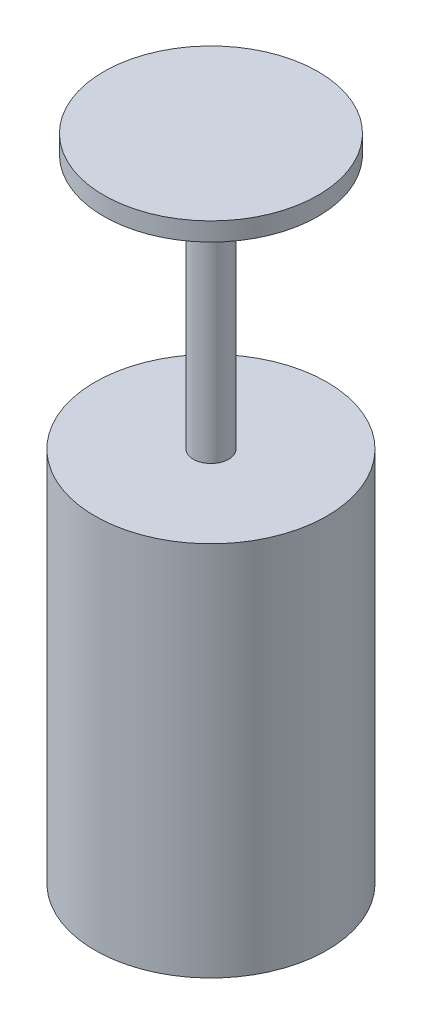
ISO-10303-21;
HEADER;
FILE_DESCRIPTION(('STEP AP214'),'2;1');
FILE_NAME('part.step','',(''),(''),'','','');
FILE_SCHEMA(('AUTOMOTIVE_DESIGN { 1 0 10303 214 1 1 1 1 }'));
ENDSEC;
DATA;
#1=APPLICATION_CONTEXT('core data for automotive mechanical design processes');
#2=APPLICATION_PROTOCOL_DEFINITION('international standard','automotive_design',2000,#1);
#3=PRODUCT_CONTEXT('',#1,'mechanical');
#4=PRODUCT('Part','Part','',(#3));
#5=PRODUCT_RELATED_PRODUCT_CATEGORY('part','',(#4));
#6=PRODUCT_DEFINITION_FORMATION('','',#4);
#7=PRODUCT_DEFINITION_CONTEXT('part definition',#1,'design');
#8=PRODUCT_DEFINITION('design','',#6,#7);
#9=PRODUCT_DEFINITION_SHAPE('','',#8);
#10=(LENGTH_UNIT() NAMED_UNIT(*) SI_UNIT(.MILLI.,.METRE.));
#11=(NAMED_UNIT(*) PLANE_ANGLE_UNIT() SI_UNIT($,.RADIAN.));
#12=(NAMED_UNIT(*) SI_UNIT($,.STERADIAN.) SOLID_ANGLE_UNIT());
#13=UNCERTAINTY_MEASURE_WITH_UNIT(LENGTH_MEASURE(1.E-05),#10,'distance_accuracy_value','');
#14=(GEOMETRIC_REPRESENTATION_CONTEXT(3) GLOBAL_UNCERTAINTY_ASSIGNED_CONTEXT((#13)) GLOBAL_UNIT_ASSIGNED_CONTEXT((#10,
#11,#12)) REPRESENTATION_CONTEXT('',''));
#15=CARTESIAN_POINT('',(0.,0.,0.));
#16=DIRECTION('',(0.,0.,1.));
#17=DIRECTION('',(1.,0.,0.));
#18=AXIS2_PLACEMENT_3D('',#15,#16,#17);
#19=CARTESIAN_POINT('',(0.,0.,0.));
#20=DIRECTION('',(0.,-1.,0.));
#21=DIRECTION('',(0.,0.,-1.));
#22=AXIS2_PLACEMENT_3D('',#19,#20,#21);
#23=CYLINDRICAL_SURFACE('',#22,16.0655);
#24=CARTESIAN_POINT('',(0.,-52.07,0.));
#25=DIRECTION('',(0.,-1.,0.));
#26=DIRECTION('',(0.,0.,-1.));
#27=AXIS2_PLACEMENT_3D('',#24,#25,#26);
#28=CIRCLE('',#27,16.0655);
#29=CARTESIAN_POINT('',(0.,-52.07,-16.0655));
#30=VERTEX_POINT('',#29);
#31=EDGE_CURVE('E58',#30,#30,#28,.T.);
#32=ORIENTED_EDGE('',*,*,#31,.F.);
#33=EDGE_LOOP('',(#32));
#34=FACE_BOUND('',#33,.T.);
#35=CARTESIAN_POINT('',(0.,0.,0.));
#36=DIRECTION('',(0.,-1.,0.));
#37=DIRECTION('',(0.,0.,-1.));
#38=AXIS2_PLACEMENT_3D('',#35,#36,#37);
#39=CIRCLE('',#38,16.0655);
#40=CARTESIAN_POINT('',(0.,0.,-16.0655));
#41=VERTEX_POINT('',#40);
#42=EDGE_CURVE('E10',#41,#41,#39,.T.);
#43=ORIENTED_EDGE('',*,*,#42,.T.);
#44=EDGE_LOOP('',(#43));
#45=FACE_BOUND('',#44,.T.);
#46=ADVANCED_FACE('F36',(#34,#45),#23,.T.);
#47=CARTESIAN_POINT('',(0.,0.,0.));
#48=DIRECTION('',(0.,-1.,0.));
#49=DIRECTION('',(0.,0.,-1.));
#50=AXIS2_PLACEMENT_3D('',#47,#48,#49);
#51=PLANE('',#50);
#52=ORIENTED_EDGE('',*,*,#42,.F.);
#53=EDGE_LOOP('',(#52));
#54=FACE_BOUND('',#53,.T.);
#55=CARTESIAN_POINT('',(0.,0.,0.));
#56=DIRECTION('',(0.,-1.,0.));
#57=DIRECTION('',(0.,0.,-1.));
#58=AXIS2_PLACEMENT_3D('',#55,#56,#57);
#59=CIRCLE('',#58,2.45056143436526);
#60=CARTESIAN_POINT('',(0.,0.,-2.45056143436526));
#61=VERTEX_POINT('',#60);
#62=EDGE_CURVE('E42',#61,#61,#59,.T.);
#63=ORIENTED_EDGE('',*,*,#62,.T.);
#64=EDGE_LOOP('',(#63));
#65=FACE_BOUND('',#64,.T.);
#66=ADVANCED_FACE('F65',(#54,#65),#51,.F.);
#67=CARTESIAN_POINT('',(0.,0.,0.));
#68=DIRECTION('',(0.,-1.,0.));
#69=DIRECTION('',(0.,0.,-1.));
#70=AXIS2_PLACEMENT_3D('',#67,#68,#69);
#71=CYLINDRICAL_SURFACE('',#70,2.45056143436526);
#72=CARTESIAN_POINT('',(0.,35.306,0.));
#73=DIRECTION('',(0.,-1.,0.));
#74=DIRECTION('',(0.,0.,-1.));
#75=AXIS2_PLACEMENT_3D('',#72,#73,#74);
#76=CIRCLE('',#75,2.45056143436526);
#77=CARTESIAN_POINT('',(0.,35.306,-2.45056143436526));
#78=VERTEX_POINT('',#77);
#79=EDGE_CURVE('E46',#78,#78,#76,.T.);
#80=ORIENTED_EDGE('',*,*,#79,.T.);
#81=EDGE_LOOP('',(#80));
#82=FACE_BOUND('',#81,.T.);
#83=ORIENTED_EDGE('',*,*,#62,.F.);
#84=EDGE_LOOP('',(#83));
#85=FACE_BOUND('',#84,.T.);
#86=ADVANCED_FACE('F69',(#82,#85),#71,.T.);
#87=CARTESIAN_POINT('',(0.,35.306,0.));
#88=DIRECTION('',(0.,-1.,0.));
#89=DIRECTION('',(0.,0.,-1.));
#90=AXIS2_PLACEMENT_3D('',#87,#88,#89);
#91=PLANE('',#90);
#92=CARTESIAN_POINT('',(0.,35.306,0.));
#93=DIRECTION('',(0.,-1.,0.));
#94=DIRECTION('',(0.,0.,-1.));
#95=AXIS2_PLACEMENT_3D('',#92,#93,#94);
#96=CIRCLE('',#95,14.8363598412573);
#97=CARTESIAN_POINT('',(0.,35.306,-14.8363598412573));
#98=VERTEX_POINT('',#97);
#99=EDGE_CURVE('E50',#98,#98,#96,.T.);
#100=ORIENTED_EDGE('',*,*,#99,.T.);
#101=EDGE_LOOP('',(#100));
#102=FACE_BOUND('',#101,.T.);
#103=ORIENTED_EDGE('',*,*,#79,.F.);
#104=EDGE_LOOP('',(#103));
#105=FACE_BOUND('',#104,.T.);
#106=ADVANCED_FACE('F74',(#102,#105),#91,.T.);
#107=CARTESIAN_POINT('',(0.,0.,0.));
#108=DIRECTION('',(0.,-1.,0.));
#109=DIRECTION('',(0.,0.,-1.));
#110=AXIS2_PLACEMENT_3D('',#107,#108,#109);
#111=CYLINDRICAL_SURFACE('',#110,14.8363598412573);
#112=CARTESIAN_POINT('',(0.,37.846,0.));
#113=DIRECTION('',(0.,-1.,0.));
#114=DIRECTION('',(0.,0.,-1.));
#115=AXIS2_PLACEMENT_3D('',#112,#113,#114);
#116=CIRCLE('',#115,14.8363598412573);
#117=CARTESIAN_POINT('',(0.,37.846,-14.8363598412573));
#118=VERTEX_POINT('',#117);
#119=EDGE_CURVE('E55',#118,#118,#116,.T.);
#120=ORIENTED_EDGE('',*,*,#119,.T.);
#121=EDGE_LOOP('',(#120));
#122=FACE_BOUND('',#121,.T.);
#123=ORIENTED_EDGE('',*,*,#99,.F.);
#124=EDGE_LOOP('',(#123));
#125=FACE_BOUND('',#124,.T.);
#126=ADVANCED_FACE('F80',(#122,#125),#111,.T.);
#127=CARTESIAN_POINT('',(0.,37.846,0.));
#128=DIRECTION('',(0.,-1.,0.));
#129=DIRECTION('',(0.,0.,-1.));
#130=AXIS2_PLACEMENT_3D('',#127,#128,#129);
#131=PLANE('',#130);
#132=ORIENTED_EDGE('',*,*,#119,.F.);
#133=EDGE_LOOP('',(#132));
#134=FACE_BOUND('',#133,.T.);
#135=ADVANCED_FACE('F84',(#134),#131,.F.);
#136=CARTESIAN_POINT('',(0.,-52.07,0.));
#137=DIRECTION('',(0.,-1.,0.));
#138=DIRECTION('',(0.,0.,-1.));
#139=AXIS2_PLACEMENT_3D('',#136,#137,#138);
#140=PLANE('',#139);
#141=ORIENTED_EDGE('',*,*,#31,.T.);
#142=EDGE_LOOP('',(#141));
#143=FACE_BOUND('',#142,.T.);
#144=ADVANCED_FACE('F62',(#143),#140,.T.);
#145=CLOSED_SHELL('',(#46,#66,#86,#106,#126,#135,#144));
#146=MANIFOLD_SOLID_BREP('B2',#145);
#147=ADVANCED_BREP_SHAPE_REPRESENTATION('',(#18,#146),#14);
#148=SHAPE_DEFINITION_REPRESENTATION(#9,#147);
ENDSEC;
END-ISO-10303-21;
